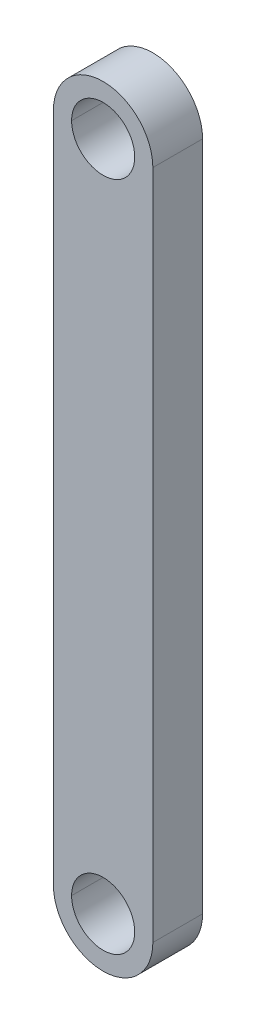
ISO-10303-21;
HEADER;
FILE_DESCRIPTION(('STEP AP214'),'2;1');
FILE_NAME('part.step','',(''),(''),'','','');
FILE_SCHEMA(('AUTOMOTIVE_DESIGN { 1 0 10303 214 1 1 1 1 }'));
ENDSEC;
DATA;
#1=APPLICATION_CONTEXT('core data for automotive mechanical design processes');
#2=APPLICATION_PROTOCOL_DEFINITION('international standard','automotive_design',2000,#1);
#3=PRODUCT_CONTEXT('',#1,'mechanical');
#4=PRODUCT('Part','Part','',(#3));
#5=PRODUCT_RELATED_PRODUCT_CATEGORY('part','',(#4));
#6=PRODUCT_DEFINITION_FORMATION('','',#4);
#7=PRODUCT_DEFINITION_CONTEXT('part definition',#1,'design');
#8=PRODUCT_DEFINITION('design','',#6,#7);
#9=PRODUCT_DEFINITION_SHAPE('','',#8);
#10=(LENGTH_UNIT() NAMED_UNIT(*) SI_UNIT(.MILLI.,.METRE.));
#11=(NAMED_UNIT(*) PLANE_ANGLE_UNIT() SI_UNIT($,.RADIAN.));
#12=(NAMED_UNIT(*) SI_UNIT($,.STERADIAN.) SOLID_ANGLE_UNIT());
#13=UNCERTAINTY_MEASURE_WITH_UNIT(LENGTH_MEASURE(1.E-05),#10,'distance_accuracy_value','');
#14=(GEOMETRIC_REPRESENTATION_CONTEXT(3) GLOBAL_UNCERTAINTY_ASSIGNED_CONTEXT((#13)) GLOBAL_UNIT_ASSIGNED_CONTEXT((#10,
#11,#12)) REPRESENTATION_CONTEXT('',''));
#15=CARTESIAN_POINT('',(0.,0.,0.));
#16=DIRECTION('',(0.,0.,1.));
#17=DIRECTION('',(1.,0.,0.));
#18=AXIS2_PLACEMENT_3D('',#15,#16,#17);
#19=CARTESIAN_POINT('',(0.,135.,0.));
#20=DIRECTION('',(0.,0.,1.));
#21=DIRECTION('',(1.,0.,0.));
#22=AXIS2_PLACEMENT_3D('',#19,#20,#21);
#23=CYLINDRICAL_SURFACE('',#22,6.35);
#24=DIRECTION('',(0.,0.,1.));
#25=VECTOR('',#24,1.);
#26=CARTESIAN_POINT('',(-6.35,135.,0.));
#27=LINE('',#26,#25);
#28=CARTESIAN_POINT('',(-6.35,135.,0.));
#29=VERTEX_POINT('',#28);
#30=CARTESIAN_POINT('',(-6.35,135.,10.));
#31=VERTEX_POINT('',#30);
#32=EDGE_CURVE('E139',#29,#31,#27,.T.);
#33=ORIENTED_EDGE('',*,*,#32,.F.);
#34=CARTESIAN_POINT('',(0.,135.,0.));
#35=DIRECTION('',(0.,0.,1.));
#36=DIRECTION('',(1.,0.,0.));
#37=AXIS2_PLACEMENT_3D('',#34,#35,#36);
#38=CIRCLE('',#37,6.35);
#39=CARTESIAN_POINT('',(6.35,135.,0.));
#40=VERTEX_POINT('',#39);
#41=EDGE_CURVE('E27',#40,#29,#38,.T.);
#42=ORIENTED_EDGE('',*,*,#41,.F.);
#43=DIRECTION('',(0.,0.,1.));
#44=VECTOR('',#43,1.);
#45=CARTESIAN_POINT('',(6.35,135.,0.));
#46=LINE('',#45,#44);
#47=CARTESIAN_POINT('',(6.35,135.,10.));
#48=VERTEX_POINT('',#47);
#49=EDGE_CURVE('E149',#40,#48,#46,.T.);
#50=ORIENTED_EDGE('',*,*,#49,.T.);
#51=CARTESIAN_POINT('',(0.,135.,10.));
#52=DIRECTION('',(0.,0.,1.));
#53=DIRECTION('',(1.,0.,0.));
#54=AXIS2_PLACEMENT_3D('',#51,#52,#53);
#55=CIRCLE('',#54,6.35);
#56=EDGE_CURVE('E127',#48,#31,#55,.T.);
#57=ORIENTED_EDGE('',*,*,#56,.T.);
#58=EDGE_LOOP('',(#33,#42,#50,#57));
#59=FACE_BOUND('',#58,.T.);
#60=ADVANCED_FACE('F16',(#59),#23,.F.);
#61=CARTESIAN_POINT('',(0.,0.,0.));
#62=DIRECTION('',(0.,0.,1.));
#63=DIRECTION('',(1.,0.,0.));
#64=AXIS2_PLACEMENT_3D('',#61,#62,#63);
#65=CYLINDRICAL_SURFACE('',#64,6.35);
#66=DIRECTION('',(0.,0.,1.));
#67=VECTOR('',#66,1.);
#68=CARTESIAN_POINT('',(-6.35,0.,0.));
#69=LINE('',#68,#67);
#70=CARTESIAN_POINT('',(-6.35,0.,0.));
#71=VERTEX_POINT('',#70);
#72=CARTESIAN_POINT('',(-6.35,0.,10.));
#73=VERTEX_POINT('',#72);
#74=EDGE_CURVE('E134',#71,#73,#69,.T.);
#75=ORIENTED_EDGE('',*,*,#74,.F.);
#76=CARTESIAN_POINT('',(0.,0.,0.));
#77=DIRECTION('',(0.,0.,1.));
#78=DIRECTION('',(1.,0.,0.));
#79=AXIS2_PLACEMENT_3D('',#76,#77,#78);
#80=CIRCLE('',#79,6.35);
#81=CARTESIAN_POINT('',(6.35,0.,0.));
#82=VERTEX_POINT('',#81);
#83=EDGE_CURVE('E11',#82,#71,#80,.T.);
#84=ORIENTED_EDGE('',*,*,#83,.F.);
#85=DIRECTION('',(0.,0.,1.));
#86=VECTOR('',#85,1.);
#87=CARTESIAN_POINT('',(6.35,0.,0.));
#88=LINE('',#87,#86);
#89=CARTESIAN_POINT('',(6.35,0.,10.));
#90=VERTEX_POINT('',#89);
#91=EDGE_CURVE('E115',#82,#90,#88,.T.);
#92=ORIENTED_EDGE('',*,*,#91,.T.);
#93=CARTESIAN_POINT('',(0.,0.,10.));
#94=DIRECTION('',(0.,0.,1.));
#95=DIRECTION('',(1.,0.,0.));
#96=AXIS2_PLACEMENT_3D('',#93,#94,#95);
#97=CIRCLE('',#96,6.35);
#98=EDGE_CURVE('E129',#90,#73,#97,.T.);
#99=ORIENTED_EDGE('',*,*,#98,.T.);
#100=EDGE_LOOP('',(#75,#84,#92,#99));
#101=FACE_BOUND('',#100,.T.);
#102=ADVANCED_FACE('F281',(#101),#65,.F.);
#103=CARTESIAN_POINT('',(0.,0.,0.));
#104=DIRECTION('',(0.,0.,1.));
#105=DIRECTION('',(1.,0.,0.));
#106=AXIS2_PLACEMENT_3D('',#103,#104,#105);
#107=PLANE('',#106);
#108=ORIENTED_EDGE('',*,*,#83,.T.);
#109=CARTESIAN_POINT('',(0.,0.,0.));
#110=DIRECTION('',(0.,0.,1.));
#111=DIRECTION('',(1.,0.,0.));
#112=AXIS2_PLACEMENT_3D('',#109,#110,#111);
#113=CIRCLE('',#112,6.35);
#114=EDGE_CURVE('E145',#71,#82,#113,.T.);
#115=ORIENTED_EDGE('',*,*,#114,.T.);
#116=EDGE_LOOP('',(#108,#115));
#117=FACE_BOUND('',#116,.T.);
#118=ORIENTED_EDGE('',*,*,#41,.T.);
#119=CARTESIAN_POINT('',(0.,135.,0.));
#120=DIRECTION('',(0.,0.,1.));
#121=DIRECTION('',(1.,0.,0.));
#122=AXIS2_PLACEMENT_3D('',#119,#120,#121);
#123=CIRCLE('',#122,6.35);
#124=EDGE_CURVE('E135',#29,#40,#123,.T.);
#125=ORIENTED_EDGE('',*,*,#124,.T.);
#126=EDGE_LOOP('',(#118,#125));
#127=FACE_BOUND('',#126,.T.);
#128=CARTESIAN_POINT('',(0.,0.,0.));
#129=DIRECTION('',(0.,0.,1.));
#130=DIRECTION('',(1.,0.,0.));
#131=AXIS2_PLACEMENT_3D('',#128,#129,#130);
#132=CIRCLE('',#131,10.);
#133=CARTESIAN_POINT('',(-10.,0.,0.));
#134=VERTEX_POINT('',#133);
#135=CARTESIAN_POINT('',(10.,0.,0.));
#136=VERTEX_POINT('',#135);
#137=EDGE_CURVE('E93',#134,#136,#132,.T.);
#138=ORIENTED_EDGE('',*,*,#137,.F.);
#139=DIRECTION('',(0.,-1.,0.));
#140=VECTOR('',#139,1.);
#141=CARTESIAN_POINT('',(-10.,0.,0.));
#142=LINE('',#141,#140);
#143=CARTESIAN_POINT('',(-10.,135.,0.));
#144=VERTEX_POINT('',#143);
#145=EDGE_CURVE('E150',#144,#134,#142,.T.);
#146=ORIENTED_EDGE('',*,*,#145,.F.);
#147=CARTESIAN_POINT('',(0.,135.,0.));
#148=DIRECTION('',(0.,0.,1.));
#149=DIRECTION('',(1.,0.,0.));
#150=AXIS2_PLACEMENT_3D('',#147,#148,#149);
#151=CIRCLE('',#150,10.);
#152=CARTESIAN_POINT('',(10.,135.,0.));
#153=VERTEX_POINT('',#152);
#154=EDGE_CURVE('E95',#153,#144,#151,.T.);
#155=ORIENTED_EDGE('',*,*,#154,.F.);
#156=DIRECTION('',(0.,1.,0.));
#157=VECTOR('',#156,1.);
#158=CARTESIAN_POINT('',(10.,0.,0.));
#159=LINE('',#158,#157);
#160=EDGE_CURVE('E89',#136,#153,#159,.T.);
#161=ORIENTED_EDGE('',*,*,#160,.F.);
#162=EDGE_LOOP('',(#138,#146,#155,#161));
#163=FACE_BOUND('',#162,.T.);
#164=ADVANCED_FACE('F91',(#117,#127,#163),#107,.F.);
#165=CARTESIAN_POINT('',(0.,0.,10.));
#166=DIRECTION('',(0.,0.,1.));
#167=DIRECTION('',(1.,0.,0.));
#168=AXIS2_PLACEMENT_3D('',#165,#166,#167);
#169=PLANE('',#168);
#170=ORIENTED_EDGE('',*,*,#98,.F.);
#171=CARTESIAN_POINT('',(0.,0.,10.));
#172=DIRECTION('',(0.,0.,1.));
#173=DIRECTION('',(1.,0.,0.));
#174=AXIS2_PLACEMENT_3D('',#171,#172,#173);
#175=CIRCLE('',#174,6.35);
#176=EDGE_CURVE('E123',#73,#90,#175,.T.);
#177=ORIENTED_EDGE('',*,*,#176,.F.);
#178=EDGE_LOOP('',(#170,#177));
#179=FACE_BOUND('',#178,.T.);
#180=ORIENTED_EDGE('',*,*,#56,.F.);
#181=CARTESIAN_POINT('',(0.,135.,10.));
#182=DIRECTION('',(0.,0.,1.));
#183=DIRECTION('',(1.,0.,0.));
#184=AXIS2_PLACEMENT_3D('',#181,#182,#183);
#185=CIRCLE('',#184,6.35);
#186=EDGE_CURVE('E180',#31,#48,#185,.T.);
#187=ORIENTED_EDGE('',*,*,#186,.F.);
#188=EDGE_LOOP('',(#180,#187));
#189=FACE_BOUND('',#188,.T.);
#190=CARTESIAN_POINT('',(0.,0.,10.));
#191=DIRECTION('',(0.,0.,1.));
#192=DIRECTION('',(1.,0.,0.));
#193=AXIS2_PLACEMENT_3D('',#190,#191,#192);
#194=CIRCLE('',#193,10.);
#195=CARTESIAN_POINT('',(-10.,0.,10.));
#196=VERTEX_POINT('',#195);
#197=CARTESIAN_POINT('',(10.,0.,10.));
#198=VERTEX_POINT('',#197);
#199=EDGE_CURVE('E20',#196,#198,#194,.T.);
#200=ORIENTED_EDGE('',*,*,#199,.T.);
#201=DIRECTION('',(0.,1.,0.));
#202=VECTOR('',#201,1.);
#203=CARTESIAN_POINT('',(10.,0.,10.));
#204=LINE('',#203,#202);
#205=CARTESIAN_POINT('',(10.,135.,10.));
#206=VERTEX_POINT('',#205);
#207=EDGE_CURVE('E106',#198,#206,#204,.T.);
#208=ORIENTED_EDGE('',*,*,#207,.T.);
#209=CARTESIAN_POINT('',(0.,135.,10.));
#210=DIRECTION('',(0.,0.,1.));
#211=DIRECTION('',(1.,0.,0.));
#212=AXIS2_PLACEMENT_3D('',#209,#210,#211);
#213=CIRCLE('',#212,10.);
#214=CARTESIAN_POINT('',(-10.,135.,10.));
#215=VERTEX_POINT('',#214);
#216=EDGE_CURVE('E153',#206,#215,#213,.T.);
#217=ORIENTED_EDGE('',*,*,#216,.T.);
#218=DIRECTION('',(0.,-1.,0.));
#219=VECTOR('',#218,1.);
#220=CARTESIAN_POINT('',(-10.,0.,10.));
#221=LINE('',#220,#219);
#222=EDGE_CURVE('E42',#215,#196,#221,.T.);
#223=ORIENTED_EDGE('',*,*,#222,.T.);
#224=EDGE_LOOP('',(#200,#208,#217,#223));
#225=FACE_BOUND('',#224,.T.);
#226=ADVANCED_FACE('F201',(#179,#189,#225),#169,.T.);
#227=CARTESIAN_POINT('',(-10.,0.,10.));
#228=DIRECTION('',(1.,0.,0.));
#229=DIRECTION('',(0.,1.,0.));
#230=AXIS2_PLACEMENT_3D('',#227,#228,#229);
#231=PLANE('',#230);
#232=ORIENTED_EDGE('',*,*,#145,.T.);
#233=DIRECTION('',(0.,0.,-1.));
#234=VECTOR('',#233,1.);
#235=CARTESIAN_POINT('',(-10.,0.,10.));
#236=LINE('',#235,#234);
#237=EDGE_CURVE('E101',#196,#134,#236,.T.);
#238=ORIENTED_EDGE('',*,*,#237,.F.);
#239=ORIENTED_EDGE('',*,*,#222,.F.);
#240=DIRECTION('',(0.,0.,-1.));
#241=VECTOR('',#240,1.);
#242=CARTESIAN_POINT('',(-10.,135.,10.));
#243=LINE('',#242,#241);
#244=EDGE_CURVE('E156',#215,#144,#243,.T.);
#245=ORIENTED_EDGE('',*,*,#244,.T.);
#246=EDGE_LOOP('',(#232,#238,#239,#245));
#247=FACE_BOUND('',#246,.T.);
#248=ADVANCED_FACE('F166',(#247),#231,.F.);
#249=CARTESIAN_POINT('',(0.,135.,10.));
#250=DIRECTION('',(0.,0.,-1.));
#251=DIRECTION('',(-1.,0.,0.));
#252=AXIS2_PLACEMENT_3D('',#249,#250,#251);
#253=CYLINDRICAL_SURFACE('',#252,10.);
#254=ORIENTED_EDGE('',*,*,#154,.T.);
#255=ORIENTED_EDGE('',*,*,#244,.F.);
#256=ORIENTED_EDGE('',*,*,#216,.F.);
#257=DIRECTION('',(0.,0.,-1.));
#258=VECTOR('',#257,1.);
#259=CARTESIAN_POINT('',(10.,135.,10.));
#260=LINE('',#259,#258);
#261=EDGE_CURVE('E100',#206,#153,#260,.T.);
#262=ORIENTED_EDGE('',*,*,#261,.T.);
#263=EDGE_LOOP('',(#254,#255,#256,#262));
#264=FACE_BOUND('',#263,.T.);
#265=ADVANCED_FACE('F169',(#264),#253,.T.);
#266=CARTESIAN_POINT('',(10.,0.,10.));
#267=DIRECTION('',(-1.,0.,0.));
#268=DIRECTION('',(0.,0.,1.));
#269=AXIS2_PLACEMENT_3D('',#266,#267,#268);
#270=PLANE('',#269);
#271=ORIENTED_EDGE('',*,*,#160,.T.);
#272=ORIENTED_EDGE('',*,*,#261,.F.);
#273=ORIENTED_EDGE('',*,*,#207,.F.);
#274=DIRECTION('',(0.,0.,-1.));
#275=VECTOR('',#274,1.);
#276=CARTESIAN_POINT('',(10.,0.,10.));
#277=LINE('',#276,#275);
#278=EDGE_CURVE('E104',#198,#136,#277,.T.);
#279=ORIENTED_EDGE('',*,*,#278,.T.);
#280=EDGE_LOOP('',(#271,#272,#273,#279));
#281=FACE_BOUND('',#280,.T.);
#282=ADVANCED_FACE('F18',(#281),#270,.F.);
#283=CARTESIAN_POINT('',(0.,0.,10.));
#284=DIRECTION('',(0.,0.,-1.));
#285=DIRECTION('',(-1.,0.,0.));
#286=AXIS2_PLACEMENT_3D('',#283,#284,#285);
#287=CYLINDRICAL_SURFACE('',#286,10.);
#288=ORIENTED_EDGE('',*,*,#137,.T.);
#289=ORIENTED_EDGE('',*,*,#278,.F.);
#290=ORIENTED_EDGE('',*,*,#199,.F.);
#291=ORIENTED_EDGE('',*,*,#237,.T.);
#292=EDGE_LOOP('',(#288,#289,#290,#291));
#293=FACE_BOUND('',#292,.T.);
#294=ADVANCED_FACE('F113',(#293),#287,.T.);
#295=CARTESIAN_POINT('',(0.,0.,0.));
#296=DIRECTION('',(0.,0.,1.));
#297=DIRECTION('',(1.,0.,0.));
#298=AXIS2_PLACEMENT_3D('',#295,#296,#297);
#299=CYLINDRICAL_SURFACE('',#298,6.35);
#300=ORIENTED_EDGE('',*,*,#114,.F.);
#301=ORIENTED_EDGE('',*,*,#74,.T.);
#302=ORIENTED_EDGE('',*,*,#176,.T.);
#303=ORIENTED_EDGE('',*,*,#91,.F.);
#304=EDGE_LOOP('',(#300,#301,#302,#303));
#305=FACE_BOUND('',#304,.T.);
#306=ADVANCED_FACE('F323',(#305),#299,.F.);
#307=CARTESIAN_POINT('',(0.,135.,0.));
#308=DIRECTION('',(0.,0.,1.));
#309=DIRECTION('',(1.,0.,0.));
#310=AXIS2_PLACEMENT_3D('',#307,#308,#309);
#311=CYLINDRICAL_SURFACE('',#310,6.35);
#312=ORIENTED_EDGE('',*,*,#124,.F.);
#313=ORIENTED_EDGE('',*,*,#32,.T.);
#314=ORIENTED_EDGE('',*,*,#186,.T.);
#315=ORIENTED_EDGE('',*,*,#49,.F.);
#316=EDGE_LOOP('',(#312,#313,#314,#315));
#317=FACE_BOUND('',#316,.T.);
#318=ADVANCED_FACE('F203',(#317),#311,.F.);
#319=CLOSED_SHELL('',(#60,#102,#164,#226,#248,#265,#282,#294,#306,#318));
#320=MANIFOLD_SOLID_BREP('B1',#319);
#321=ADVANCED_BREP_SHAPE_REPRESENTATION('',(#18,#320),#14);
#322=SHAPE_DEFINITION_REPRESENTATION(#9,#321);
ENDSEC;
END-ISO-10303-21;
